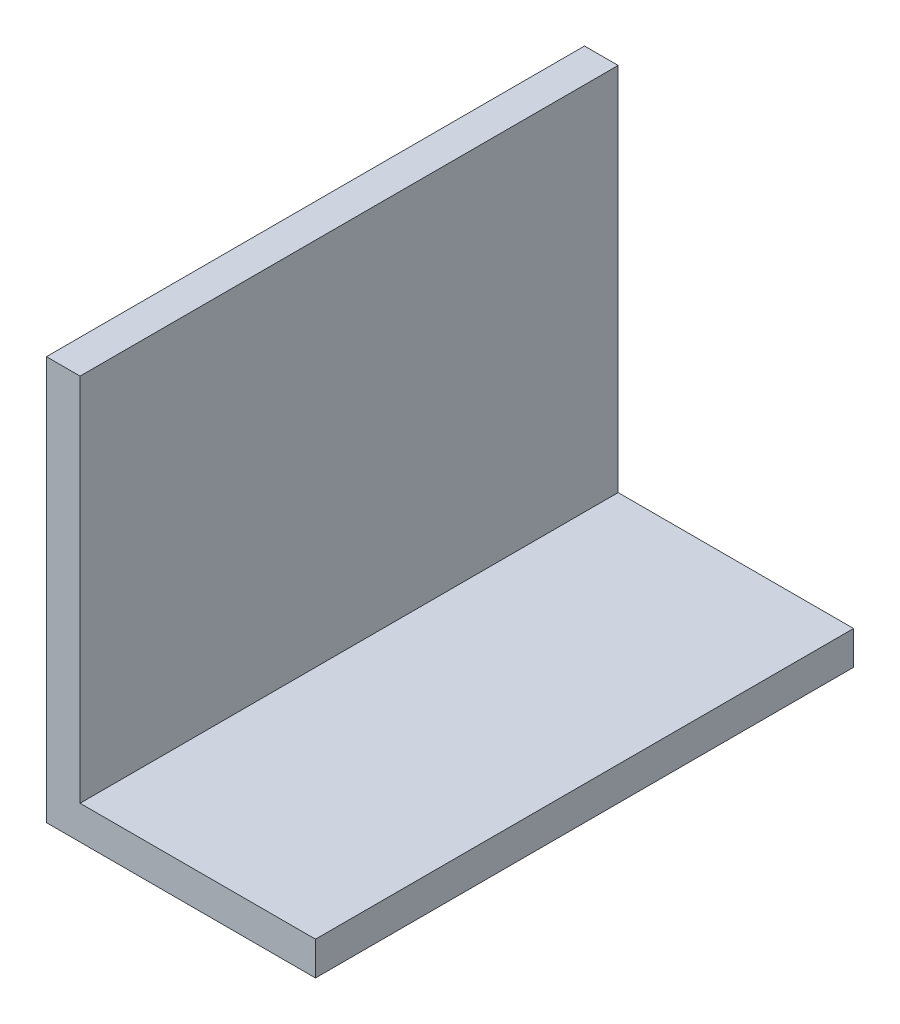
ISO-10303-21;
HEADER;
FILE_DESCRIPTION(('STEP AP214'),'2;1');
FILE_NAME('part.step','',(''),(''),'','','');
FILE_SCHEMA(('AUTOMOTIVE_DESIGN { 1 0 10303 214 1 1 1 1 }'));
ENDSEC;
DATA;
#1=APPLICATION_CONTEXT('core data for automotive mechanical design processes');
#2=APPLICATION_PROTOCOL_DEFINITION('international standard','automotive_design',2000,#1);
#3=PRODUCT_CONTEXT('',#1,'mechanical');
#4=PRODUCT('Part','Part','',(#3));
#5=PRODUCT_RELATED_PRODUCT_CATEGORY('part','',(#4));
#6=PRODUCT_DEFINITION_FORMATION('','',#4);
#7=PRODUCT_DEFINITION_CONTEXT('part definition',#1,'design');
#8=PRODUCT_DEFINITION('design','',#6,#7);
#9=PRODUCT_DEFINITION_SHAPE('','',#8);
#10=(LENGTH_UNIT() NAMED_UNIT(*) SI_UNIT(.MILLI.,.METRE.));
#11=(NAMED_UNIT(*) PLANE_ANGLE_UNIT() SI_UNIT($,.RADIAN.));
#12=(NAMED_UNIT(*) SI_UNIT($,.STERADIAN.) SOLID_ANGLE_UNIT());
#13=UNCERTAINTY_MEASURE_WITH_UNIT(LENGTH_MEASURE(1.E-05),#10,'distance_accuracy_value','');
#14=(GEOMETRIC_REPRESENTATION_CONTEXT(3) GLOBAL_UNCERTAINTY_ASSIGNED_CONTEXT((#13)) GLOBAL_UNIT_ASSIGNED_CONTEXT((#10,
#11,#12)) REPRESENTATION_CONTEXT('',''));
#15=CARTESIAN_POINT('',(0.,0.,0.));
#16=DIRECTION('',(0.,0.,1.));
#17=DIRECTION('',(1.,0.,0.));
#18=AXIS2_PLACEMENT_3D('',#15,#16,#17);
#19=CARTESIAN_POINT('',(0.,0.,50.8));
#20=DIRECTION('',(0.,1.,0.));
#21=DIRECTION('',(0.,0.,1.));
#22=AXIS2_PLACEMENT_3D('',#19,#20,#21);
#23=PLANE('',#22);
#24=DIRECTION('',(1.,0.,0.));
#25=VECTOR('',#24,1.);
#26=CARTESIAN_POINT('',(0.,0.,0.));
#27=LINE('',#26,#25);
#28=CARTESIAN_POINT('',(0.,0.,0.));
#29=VERTEX_POINT('',#28);
#30=CARTESIAN_POINT('',(25.4,0.,0.));
#31=VERTEX_POINT('',#30);
#32=EDGE_CURVE('E114',#29,#31,#27,.T.);
#33=ORIENTED_EDGE('',*,*,#32,.T.);
#34=DIRECTION('',(0.,0.,-1.));
#35=VECTOR('',#34,1.);
#36=CARTESIAN_POINT('',(25.4,0.,50.8));
#37=LINE('',#36,#35);
#38=CARTESIAN_POINT('',(25.4,0.,50.8));
#39=VERTEX_POINT('',#38);
#40=EDGE_CURVE('E11',#39,#31,#37,.T.);
#41=ORIENTED_EDGE('',*,*,#40,.F.);
#42=DIRECTION('',(1.,0.,0.));
#43=VECTOR('',#42,1.);
#44=CARTESIAN_POINT('',(0.,0.,50.8));
#45=LINE('',#44,#43);
#46=CARTESIAN_POINT('',(0.,0.,50.8));
#47=VERTEX_POINT('',#46);
#48=EDGE_CURVE('E79',#47,#39,#45,.T.);
#49=ORIENTED_EDGE('',*,*,#48,.F.);
#50=DIRECTION('',(0.,0.,-1.));
#51=VECTOR('',#50,1.);
#52=CARTESIAN_POINT('',(0.,0.,50.8));
#53=LINE('',#52,#51);
#54=EDGE_CURVE('E110',#47,#29,#53,.T.);
#55=ORIENTED_EDGE('',*,*,#54,.T.);
#56=EDGE_LOOP('',(#33,#41,#49,#55));
#57=FACE_BOUND('',#56,.T.);
#58=ADVANCED_FACE('F33',(#57),#23,.F.);
#59=CARTESIAN_POINT('',(25.4,3.175,50.8));
#60=DIRECTION('',(1.,0.,0.));
#61=DIRECTION('',(0.,0.,-1.));
#62=AXIS2_PLACEMENT_3D('',#59,#60,#61);
#63=PLANE('',#62);
#64=DIRECTION('',(0.,-1.,0.));
#65=VECTOR('',#64,1.);
#66=CARTESIAN_POINT('',(25.4,3.175,0.));
#67=LINE('',#66,#65);
#68=CARTESIAN_POINT('',(25.4,3.175,0.));
#69=VERTEX_POINT('',#68);
#70=EDGE_CURVE('E117',#69,#31,#67,.T.);
#71=ORIENTED_EDGE('',*,*,#70,.F.);
#72=DIRECTION('',(0.,0.,-1.));
#73=VECTOR('',#72,1.);
#74=CARTESIAN_POINT('',(25.4,3.175,50.8));
#75=LINE('',#74,#73);
#76=CARTESIAN_POINT('',(25.4,3.175,50.8));
#77=VERTEX_POINT('',#76);
#78=EDGE_CURVE('E41',#77,#69,#75,.T.);
#79=ORIENTED_EDGE('',*,*,#78,.F.);
#80=DIRECTION('',(0.,-1.,0.));
#81=VECTOR('',#80,1.);
#82=CARTESIAN_POINT('',(25.4,3.175,50.8));
#83=LINE('',#82,#81);
#84=EDGE_CURVE('E203',#77,#39,#83,.T.);
#85=ORIENTED_EDGE('',*,*,#84,.T.);
#86=ORIENTED_EDGE('',*,*,#40,.T.);
#87=EDGE_LOOP('',(#71,#79,#85,#86));
#88=FACE_BOUND('',#87,.T.);
#89=ADVANCED_FACE('F135',(#88),#63,.T.);
#90=CARTESIAN_POINT('',(0.,3.175,50.8));
#91=DIRECTION('',(0.,1.,0.));
#92=DIRECTION('',(0.,0.,1.));
#93=AXIS2_PLACEMENT_3D('',#90,#91,#92);
#94=PLANE('',#93);
#95=DIRECTION('',(1.,0.,0.));
#96=VECTOR('',#95,1.);
#97=CARTESIAN_POINT('',(0.,3.175,0.));
#98=LINE('',#97,#96);
#99=CARTESIAN_POINT('',(3.175,3.175,0.));
#100=VERTEX_POINT('',#99);
#101=EDGE_CURVE('E120',#100,#69,#98,.T.);
#102=ORIENTED_EDGE('',*,*,#101,.F.);
#103=DIRECTION('',(0.,0.,-1.));
#104=VECTOR('',#103,1.);
#105=CARTESIAN_POINT('',(3.175,3.175,50.8));
#106=LINE('',#105,#104);
#107=CARTESIAN_POINT('',(3.175,3.175,50.8));
#108=VERTEX_POINT('',#107);
#109=EDGE_CURVE('E100',#108,#100,#106,.T.);
#110=ORIENTED_EDGE('',*,*,#109,.F.);
#111=DIRECTION('',(1.,0.,0.));
#112=VECTOR('',#111,1.);
#113=CARTESIAN_POINT('',(0.,3.175,50.8));
#114=LINE('',#113,#112);
#115=EDGE_CURVE('E106',#108,#77,#114,.T.);
#116=ORIENTED_EDGE('',*,*,#115,.T.);
#117=ORIENTED_EDGE('',*,*,#78,.T.);
#118=EDGE_LOOP('',(#102,#110,#116,#117));
#119=FACE_BOUND('',#118,.T.);
#120=ADVANCED_FACE('F132',(#119),#94,.T.);
#121=CARTESIAN_POINT('',(3.175,0.,50.8));
#122=DIRECTION('',(1.,0.,0.));
#123=DIRECTION('',(0.,0.,-1.));
#124=AXIS2_PLACEMENT_3D('',#121,#122,#123);
#125=PLANE('',#124);
#126=DIRECTION('',(0.,1.,0.));
#127=VECTOR('',#126,1.);
#128=CARTESIAN_POINT('',(3.175,0.,0.));
#129=LINE('',#128,#127);
#130=CARTESIAN_POINT('',(3.175,38.1,0.));
#131=VERTEX_POINT('',#130);
#132=EDGE_CURVE('E95',#131,#100,#129,.F.);
#133=ORIENTED_EDGE('',*,*,#132,.F.);
#134=DIRECTION('',(0.,0.,-1.));
#135=VECTOR('',#134,1.);
#136=CARTESIAN_POINT('',(3.175,38.1,50.8));
#137=LINE('',#136,#135);
#138=CARTESIAN_POINT('',(3.175,38.1,50.8));
#139=VERTEX_POINT('',#138);
#140=EDGE_CURVE('E90',#139,#131,#137,.T.);
#141=ORIENTED_EDGE('',*,*,#140,.F.);
#142=DIRECTION('',(0.,1.,0.));
#143=VECTOR('',#142,1.);
#144=CARTESIAN_POINT('',(3.175,0.,50.8));
#145=LINE('',#144,#143);
#146=EDGE_CURVE('E93',#139,#108,#145,.F.);
#147=ORIENTED_EDGE('',*,*,#146,.T.);
#148=ORIENTED_EDGE('',*,*,#109,.T.);
#149=EDGE_LOOP('',(#133,#141,#147,#148));
#150=FACE_BOUND('',#149,.T.);
#151=ADVANCED_FACE('F92',(#150),#125,.T.);
#152=CARTESIAN_POINT('',(0.,38.1,50.8));
#153=DIRECTION('',(0.,1.,0.));
#154=DIRECTION('',(0.,0.,1.));
#155=AXIS2_PLACEMENT_3D('',#152,#153,#154);
#156=PLANE('',#155);
#157=DIRECTION('',(1.,0.,0.));
#158=VECTOR('',#157,1.);
#159=CARTESIAN_POINT('',(0.,38.1,0.));
#160=LINE('',#159,#158);
#161=CARTESIAN_POINT('',(0.,38.1,0.));
#162=VERTEX_POINT('',#161);
#163=EDGE_CURVE('E124',#162,#131,#160,.T.);
#164=ORIENTED_EDGE('',*,*,#163,.F.);
#165=DIRECTION('',(0.,0.,-1.));
#166=VECTOR('',#165,1.);
#167=CARTESIAN_POINT('',(0.,38.1,50.8));
#168=LINE('',#167,#166);
#169=CARTESIAN_POINT('',(0.,38.1,50.8));
#170=VERTEX_POINT('',#169);
#171=EDGE_CURVE('E70',#170,#162,#168,.T.);
#172=ORIENTED_EDGE('',*,*,#171,.F.);
#173=DIRECTION('',(1.,0.,0.));
#174=VECTOR('',#173,1.);
#175=CARTESIAN_POINT('',(0.,38.1,50.8));
#176=LINE('',#175,#174);
#177=EDGE_CURVE('E104',#170,#139,#176,.T.);
#178=ORIENTED_EDGE('',*,*,#177,.T.);
#179=ORIENTED_EDGE('',*,*,#140,.T.);
#180=EDGE_LOOP('',(#164,#172,#178,#179));
#181=FACE_BOUND('',#180,.T.);
#182=ADVANCED_FACE('F108',(#181),#156,.T.);
#183=CARTESIAN_POINT('',(0.,0.,50.8));
#184=DIRECTION('',(1.,0.,0.));
#185=DIRECTION('',(0.,0.,-1.));
#186=AXIS2_PLACEMENT_3D('',#183,#184,#185);
#187=PLANE('',#186);
#188=DIRECTION('',(0.,-1.,0.));
#189=VECTOR('',#188,1.);
#190=CARTESIAN_POINT('',(0.,0.,0.));
#191=LINE('',#190,#189);
#192=EDGE_CURVE('E73',#162,#29,#191,.T.);
#193=ORIENTED_EDGE('',*,*,#192,.T.);
#194=ORIENTED_EDGE('',*,*,#54,.F.);
#195=DIRECTION('',(0.,-1.,0.));
#196=VECTOR('',#195,1.);
#197=CARTESIAN_POINT('',(0.,0.,50.8));
#198=LINE('',#197,#196);
#199=EDGE_CURVE('E49',#170,#47,#198,.T.);
#200=ORIENTED_EDGE('',*,*,#199,.F.);
#201=ORIENTED_EDGE('',*,*,#171,.T.);
#202=EDGE_LOOP('',(#193,#194,#200,#201));
#203=FACE_BOUND('',#202,.T.);
#204=ADVANCED_FACE('F140',(#203),#187,.F.);
#205=CARTESIAN_POINT('',(0.,0.,50.8));
#206=DIRECTION('',(0.,0.,-1.));
#207=DIRECTION('',(-1.,0.,0.));
#208=AXIS2_PLACEMENT_3D('',#205,#206,#207);
#209=PLANE('',#208);
#210=ORIENTED_EDGE('',*,*,#48,.T.);
#211=ORIENTED_EDGE('',*,*,#84,.F.);
#212=ORIENTED_EDGE('',*,*,#115,.F.);
#213=ORIENTED_EDGE('',*,*,#146,.F.);
#214=ORIENTED_EDGE('',*,*,#177,.F.);
#215=ORIENTED_EDGE('',*,*,#199,.T.);
#216=EDGE_LOOP('',(#210,#211,#212,#213,#214,#215));
#217=FACE_BOUND('',#216,.T.);
#218=ADVANCED_FACE('F103',(#217),#209,.F.);
#219=CARTESIAN_POINT('',(0.,0.,0.));
#220=DIRECTION('',(0.,0.,-1.));
#221=DIRECTION('',(-1.,0.,0.));
#222=AXIS2_PLACEMENT_3D('',#219,#220,#221);
#223=PLANE('',#222);
#224=ORIENTED_EDGE('',*,*,#32,.F.);
#225=ORIENTED_EDGE('',*,*,#192,.F.);
#226=ORIENTED_EDGE('',*,*,#163,.T.);
#227=ORIENTED_EDGE('',*,*,#132,.T.);
#228=ORIENTED_EDGE('',*,*,#101,.T.);
#229=ORIENTED_EDGE('',*,*,#70,.T.);
#230=EDGE_LOOP('',(#224,#225,#226,#227,#228,#229));
#231=FACE_BOUND('',#230,.T.);
#232=ADVANCED_FACE('F138',(#231),#223,.T.);
#233=CLOSED_SHELL('',(#58,#89,#120,#151,#182,#204,#218,#232));
#234=MANIFOLD_SOLID_BREP('B2',#233);
#235=ADVANCED_BREP_SHAPE_REPRESENTATION('',(#18,#234),#14);
#236=SHAPE_DEFINITION_REPRESENTATION(#9,#235);
ENDSEC;
END-ISO-10303-21;
